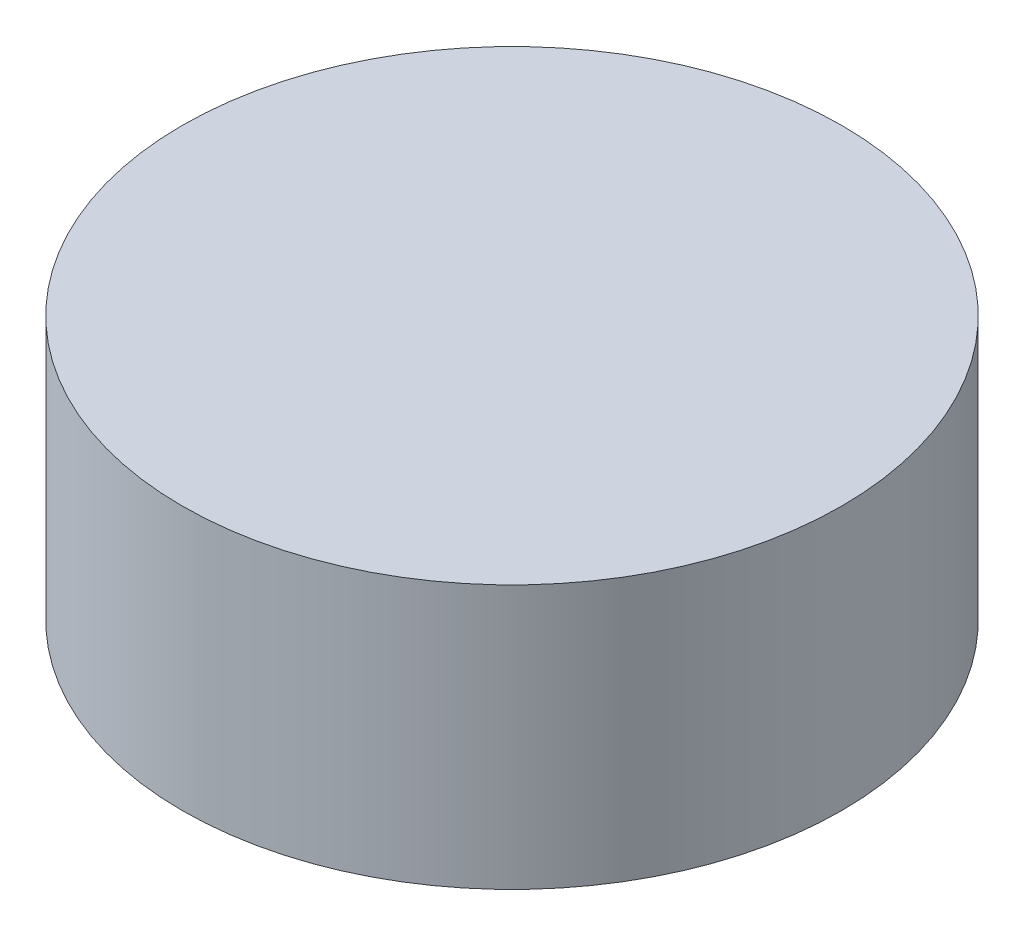
ISO-10303-21;
HEADER;
FILE_DESCRIPTION(('STEP AP214'),'2;1');
FILE_NAME('part.step','',(''),(''),'','','');
FILE_SCHEMA(('AUTOMOTIVE_DESIGN { 1 0 10303 214 1 1 1 1 }'));
ENDSEC;
DATA;
#1=APPLICATION_CONTEXT('core data for automotive mechanical design processes');
#2=APPLICATION_PROTOCOL_DEFINITION('international standard','automotive_design',2000,#1);
#3=PRODUCT_CONTEXT('',#1,'mechanical');
#4=PRODUCT('Part','Part','',(#3));
#5=PRODUCT_RELATED_PRODUCT_CATEGORY('part','',(#4));
#6=PRODUCT_DEFINITION_FORMATION('','',#4);
#7=PRODUCT_DEFINITION_CONTEXT('part definition',#1,'design');
#8=PRODUCT_DEFINITION('design','',#6,#7);
#9=PRODUCT_DEFINITION_SHAPE('','',#8);
#10=(LENGTH_UNIT() NAMED_UNIT(*) SI_UNIT(.MILLI.,.METRE.));
#11=(NAMED_UNIT(*) PLANE_ANGLE_UNIT() SI_UNIT($,.RADIAN.));
#12=(NAMED_UNIT(*) SI_UNIT($,.STERADIAN.) SOLID_ANGLE_UNIT());
#13=UNCERTAINTY_MEASURE_WITH_UNIT(LENGTH_MEASURE(1.E-05),#10,'distance_accuracy_value','');
#14=(GEOMETRIC_REPRESENTATION_CONTEXT(3) GLOBAL_UNCERTAINTY_ASSIGNED_CONTEXT((#13)) GLOBAL_UNIT_ASSIGNED_CONTEXT((#10,
#11,#12)) REPRESENTATION_CONTEXT('',''));
#15=CARTESIAN_POINT('',(0.,0.,0.));
#16=DIRECTION('',(0.,0.,1.));
#17=DIRECTION('',(1.,0.,0.));
#18=AXIS2_PLACEMENT_3D('',#15,#16,#17);
#19=CARTESIAN_POINT('',(0.,-43.2877703826955,0.));
#20=DIRECTION('',(0.,-1.,0.));
#21=DIRECTION('',(1.,0.,0.));
#22=AXIS2_PLACEMENT_3D('',#19,#20,#21);
#23=PLANE('',#22);
#24=CARTESIAN_POINT('',(0.,-43.2877703826955,0.));
#25=DIRECTION('',(0.,1.,0.));
#26=DIRECTION('',(-1.,0.,0.));
#27=AXIS2_PLACEMENT_3D('',#24,#25,#26);
#28=CIRCLE('',#27,50.);
#29=CARTESIAN_POINT('',(-50.,-43.2877703826955,0.));
#30=VERTEX_POINT('',#29);
#31=EDGE_CURVE('E10',#30,#30,#28,.T.);
#32=ORIENTED_EDGE('',*,*,#31,.F.);
#33=EDGE_LOOP('',(#32));
#34=FACE_BOUND('',#33,.T.);
#35=ADVANCED_FACE('F33',(#34),#23,.T.);
#36=CARTESIAN_POINT('',(0.,-3.28777038269552,0.));
#37=DIRECTION('',(0.,1.,0.));
#38=DIRECTION('',(-1.,0.,0.));
#39=AXIS2_PLACEMENT_3D('',#36,#37,#38);
#40=CYLINDRICAL_SURFACE('',#39,50.);
#41=ORIENTED_EDGE('',*,*,#31,.T.);
#42=EDGE_LOOP('',(#41));
#43=FACE_BOUND('',#42,.T.);
#44=CARTESIAN_POINT('',(0.,-3.28777038269552,0.));
#45=DIRECTION('',(0.,1.,0.));
#46=DIRECTION('',(-1.,0.,0.));
#47=AXIS2_PLACEMENT_3D('',#44,#45,#46);
#48=CIRCLE('',#47,50.);
#49=CARTESIAN_POINT('',(-50.,-3.28777038269552,0.));
#50=VERTEX_POINT('',#49);
#51=EDGE_CURVE('E39',#50,#50,#48,.T.);
#52=ORIENTED_EDGE('',*,*,#51,.F.);
#53=EDGE_LOOP('',(#52));
#54=FACE_BOUND('',#53,.T.);
#55=ADVANCED_FACE('F47',(#43,#54),#40,.T.);
#56=CARTESIAN_POINT('',(-50.,-3.28777038269551,0.));
#57=DIRECTION('',(0.,1.,0.));
#58=DIRECTION('',(-1.,0.,0.));
#59=AXIS2_PLACEMENT_3D('',#56,#57,#58);
#60=PLANE('',#59);
#61=ORIENTED_EDGE('',*,*,#51,.T.);
#62=EDGE_LOOP('',(#61));
#63=FACE_BOUND('',#62,.T.);
#64=ADVANCED_FACE('F45',(#63),#60,.T.);
#65=CLOSED_SHELL('',(#35,#55,#64));
#66=MANIFOLD_SOLID_BREP('B2',#65);
#67=ADVANCED_BREP_SHAPE_REPRESENTATION('',(#18,#66),#14);
#68=SHAPE_DEFINITION_REPRESENTATION(#9,#67);
ENDSEC;
END-ISO-10303-21;
